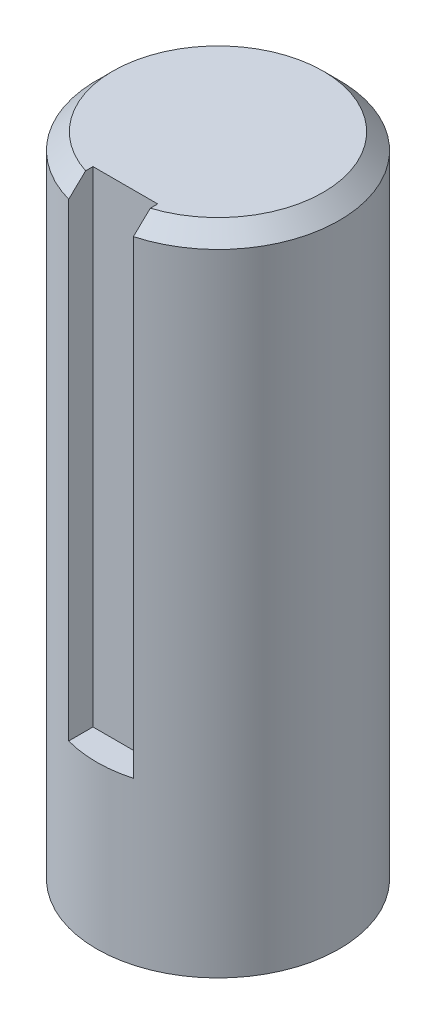
ISO-10303-21;
HEADER;
FILE_DESCRIPTION(('STEP AP214'),'2;1');
FILE_NAME('part.step','',(''),(''),'','','');
FILE_SCHEMA(('AUTOMOTIVE_DESIGN { 1 0 10303 214 1 1 1 1 }'));
ENDSEC;
DATA;
#1=APPLICATION_CONTEXT('core data for automotive mechanical design processes');
#2=APPLICATION_PROTOCOL_DEFINITION('international standard','automotive_design',2000,#1);
#3=PRODUCT_CONTEXT('',#1,'mechanical');
#4=PRODUCT('Part','Part','',(#3));
#5=PRODUCT_RELATED_PRODUCT_CATEGORY('part','',(#4));
#6=PRODUCT_DEFINITION_FORMATION('','',#4);
#7=PRODUCT_DEFINITION_CONTEXT('part definition',#1,'design');
#8=PRODUCT_DEFINITION('design','',#6,#7);
#9=PRODUCT_DEFINITION_SHAPE('','',#8);
#10=(LENGTH_UNIT() NAMED_UNIT(*) SI_UNIT(.MILLI.,.METRE.));
#11=(NAMED_UNIT(*) PLANE_ANGLE_UNIT() SI_UNIT($,.RADIAN.));
#12=(NAMED_UNIT(*) SI_UNIT($,.STERADIAN.) SOLID_ANGLE_UNIT());
#13=UNCERTAINTY_MEASURE_WITH_UNIT(LENGTH_MEASURE(1.E-05),#10,'distance_accuracy_value','');
#14=(GEOMETRIC_REPRESENTATION_CONTEXT(3) GLOBAL_UNCERTAINTY_ASSIGNED_CONTEXT((#13)) GLOBAL_UNIT_ASSIGNED_CONTEXT((#10,
#11,#12)) REPRESENTATION_CONTEXT('',''));
#15=CARTESIAN_POINT('',(0.,0.,0.));
#16=DIRECTION('',(0.,0.,1.));
#17=DIRECTION('',(1.,0.,0.));
#18=AXIS2_PLACEMENT_3D('',#15,#16,#17);
#19=CARTESIAN_POINT('',(0.,80.,0.));
#20=DIRECTION('',(0.,-1.,0.));
#21=DIRECTION('',(0.,0.,-1.));
#22=AXIS2_PLACEMENT_3D('',#19,#20,#21);
#23=CYLINDRICAL_SURFACE('',#22,15.);
#24=CARTESIAN_POINT('',(0.,20.,0.));
#25=DIRECTION('',(0.,1.,0.));
#26=DIRECTION('',(0.,0.,1.));
#27=AXIS2_PLACEMENT_3D('',#24,#25,#26);
#28=CIRCLE('',#27,15.);
#29=CARTESIAN_POINT('',(-4.,20.,14.456832294801));
#30=VERTEX_POINT('',#29);
#31=CARTESIAN_POINT('',(4.,20.,14.456832294801));
#32=VERTEX_POINT('',#31);
#33=EDGE_CURVE('E106',#30,#32,#28,.T.);
#34=ORIENTED_EDGE('',*,*,#33,.F.);
#35=DIRECTION('',(0.,1.,0.));
#36=VECTOR('',#35,1.);
#37=CARTESIAN_POINT('',(-4.,20.,14.456832294801));
#38=LINE('',#37,#36);
#39=CARTESIAN_POINT('',(-4.,78.,14.456832294801));
#40=VERTEX_POINT('',#39);
#41=EDGE_CURVE('E91',#30,#40,#38,.T.);
#42=ORIENTED_EDGE('',*,*,#41,.T.);
#43=CARTESIAN_POINT('',(0.,78.,0.));
#44=DIRECTION('',(0.,1.,0.));
#45=DIRECTION('',(0.,0.,1.));
#46=AXIS2_PLACEMENT_3D('',#43,#44,#45);
#47=CIRCLE('',#46,15.);
#48=CARTESIAN_POINT('',(4.,78.,14.456832294801));
#49=VERTEX_POINT('',#48);
#50=EDGE_CURVE('E134',#40,#49,#47,.F.);
#51=ORIENTED_EDGE('',*,*,#50,.T.);
#52=DIRECTION('',(0.,1.,0.));
#53=VECTOR('',#52,1.);
#54=CARTESIAN_POINT('',(4.,20.,14.456832294801));
#55=LINE('',#54,#53);
#56=EDGE_CURVE('E63',#32,#49,#55,.T.);
#57=ORIENTED_EDGE('',*,*,#56,.F.);
#58=EDGE_LOOP('',(#34,#42,#51,#57));
#59=FACE_BOUND('',#58,.T.);
#60=CARTESIAN_POINT('',(0.,0.,0.));
#61=DIRECTION('',(0.,1.,0.));
#62=DIRECTION('',(0.,0.,1.));
#63=AXIS2_PLACEMENT_3D('',#60,#61,#62);
#64=CIRCLE('',#63,15.);
#65=CARTESIAN_POINT('',(0.,0.,15.));
#66=VERTEX_POINT('',#65);
#67=EDGE_CURVE('E124',#66,#66,#64,.T.);
#68=ORIENTED_EDGE('',*,*,#67,.T.);
#69=EDGE_LOOP('',(#68));
#70=FACE_BOUND('',#69,.T.);
#71=ADVANCED_FACE('F41',(#59,#70),#23,.T.);
#72=CARTESIAN_POINT('',(0.,80.,0.));
#73=DIRECTION('',(0.,1.,0.));
#74=DIRECTION('',(0.,0.,1.));
#75=AXIS2_PLACEMENT_3D('',#72,#73,#74);
#76=PLANE('',#75);
#77=DIRECTION('',(0.,0.,1.));
#78=VECTOR('',#77,1.);
#79=CARTESIAN_POINT('',(-4.,80.,14.456832294801));
#80=LINE('',#79,#78);
#81=CARTESIAN_POINT('',(-4.,80.,11.456832294801));
#82=VERTEX_POINT('',#81);
#83=CARTESIAN_POINT('',(-4.,80.,12.3693168768529));
#84=VERTEX_POINT('',#83);
#85=EDGE_CURVE('E116',#82,#84,#80,.T.);
#86=ORIENTED_EDGE('',*,*,#85,.F.);
#87=DIRECTION('',(-1.,0.,0.));
#88=VECTOR('',#87,1.);
#89=CARTESIAN_POINT('',(4.,80.,11.456832294801));
#90=LINE('',#89,#88);
#91=CARTESIAN_POINT('',(4.,80.,11.456832294801));
#92=VERTEX_POINT('',#91);
#93=EDGE_CURVE('E108',#92,#82,#90,.T.);
#94=ORIENTED_EDGE('',*,*,#93,.F.);
#95=DIRECTION('',(0.,0.,-1.));
#96=VECTOR('',#95,1.);
#97=CARTESIAN_POINT('',(4.,80.,14.456832294801));
#98=LINE('',#97,#96);
#99=CARTESIAN_POINT('',(4.,80.,12.3693168768529));
#100=VERTEX_POINT('',#99);
#101=EDGE_CURVE('E118',#100,#92,#98,.T.);
#102=ORIENTED_EDGE('',*,*,#101,.F.);
#103=CARTESIAN_POINT('',(0.,80.,0.));
#104=DIRECTION('',(0.,1.,0.));
#105=DIRECTION('',(0.,0.,1.));
#106=AXIS2_PLACEMENT_3D('',#103,#104,#105);
#107=CIRCLE('',#106,13.);
#108=EDGE_CURVE('E131',#100,#84,#107,.T.);
#109=ORIENTED_EDGE('',*,*,#108,.T.);
#110=EDGE_LOOP('',(#86,#94,#102,#109));
#111=FACE_BOUND('',#110,.T.);
#112=ADVANCED_FACE('F149',(#111),#76,.T.);
#113=CARTESIAN_POINT('',(0.,0.,0.));
#114=DIRECTION('',(0.,1.,0.));
#115=DIRECTION('',(0.,0.,1.));
#116=AXIS2_PLACEMENT_3D('',#113,#114,#115);
#117=PLANE('',#116);
#118=ORIENTED_EDGE('',*,*,#67,.F.);
#119=EDGE_LOOP('',(#118));
#120=FACE_BOUND('',#119,.T.);
#121=ADVANCED_FACE('F152',(#120),#117,.F.);
#122=CARTESIAN_POINT('',(0.,80.,0.));
#123=DIRECTION('',(0.,-1.,0.));
#124=DIRECTION('',(0.,0.,-1.));
#125=AXIS2_PLACEMENT_3D('',#122,#123,#124);
#126=CONICAL_SURFACE('',#125,13.,0.785398163397449);
#127=CARTESIAN_POINT('',(-4.,83.6057512754639,8.50011229916679));
#128=CARTESIAN_POINT('',(-4.,83.4518412492222,8.67020473871914));
#129=CARTESIAN_POINT('',(-4.,83.2974792863819,8.83988694869966));
#130=CARTESIAN_POINT('',(-4.,82.9879712756458,9.17853305812137));
#131=CARTESIAN_POINT('',(-4.,82.8328252324362,9.34749696184454));
#132=CARTESIAN_POINT('',(-4.,82.3663952504219,9.85345949572392));
#133=CARTESIAN_POINT('',(-4.,82.0541121686576,10.1895369835245));
#134=CARTESIAN_POINT('',(-4.,81.4275669431542,10.8598044699871));
#135=CARTESIAN_POINT('',(-4.,81.1133049094371,11.1939945716546));
#136=CARTESIAN_POINT('',(-4.,80.4832337069049,11.86091656471));
#137=CARTESIAN_POINT('',(-4.,80.1674245274185,12.1936484460099));
#138=CARTESIAN_POINT('',(-4.,79.2182481145543,13.1900652140549));
#139=CARTESIAN_POINT('',(-4.,78.5830763563553,13.8520304992261));
#140=CARTESIAN_POINT('',(-4.,77.3096120960346,15.1729623288266));
#141=CARTESIAN_POINT('',(-4.,76.6713195559216,15.8319288365604));
#142=CARTESIAN_POINT('',(-4.,75.7769086995619,16.7522731100043));
#143=CARTESIAN_POINT('',(-4.,75.5217006461428,17.0145361760872));
#144=CARTESIAN_POINT('',(-4.,75.0109765950076,17.5387702317973));
#145=CARTESIAN_POINT('',(-4.,74.7554605925808,17.8007412168356));
#146=CARTESIAN_POINT('',(-4.,74.4998128324926,18.062583570265));
#147=B_SPLINE_CURVE_WITH_KNOTS('',3,(#127,#128,#129,#130,#131,#132,#133,#134,#135,#136,#137,
#138,#139,#140,#141,#142,#143,#144,#145,#146),.UNSPECIFIED.,.F.,.F.,(4,2,2,2,2,2,2,2,2,4),(0.,
0.688167484228455,1.37633086037428,2.7526250650912,4.12884341723394,5.5050712750682,
8.2572830843817,11.0095284818867,12.1073523284534,13.205193186608),.UNSPECIFIED.);
#148=EDGE_CURVE('E11',#84,#40,#147,.T.);
#149=ORIENTED_EDGE('',*,*,#148,.F.);
#150=ORIENTED_EDGE('',*,*,#108,.F.);
#151=CARTESIAN_POINT('',(4.,74.4998128324926,18.062583570265));
#152=CARTESIAN_POINT('',(4.,74.8841828699195,17.668886768575));
#153=CARTESIAN_POINT('',(4.,75.268266391296,17.2749096158912));
#154=CARTESIAN_POINT('',(4.,76.0356952868894,16.4862378057951));
#155=CARTESIAN_POINT('',(4.,76.4190406617419,16.0915431490011));
#156=CARTESIAN_POINT('',(4.,77.1848019881165,15.3013065314426));
#157=CARTESIAN_POINT('',(4.,77.5672180028687,14.9057646319736));
#158=CARTESIAN_POINT('',(4.,78.3309119640226,14.1135837323542));
#159=CARTESIAN_POINT('',(4.,78.7121899112966,13.716944733045));
#160=CARTESIAN_POINT('',(4.,79.4733136977631,12.9222408679139));
#161=CARTESIAN_POINT('',(4.,79.8531594342154,12.5241759036489));
#162=CARTESIAN_POINT('',(4.,80.6109373999806,11.7262333815328));
#163=CARTESIAN_POINT('',(4.,80.9888696471683,11.3263558406803));
#164=CARTESIAN_POINT('',(4.,81.553842420265,10.7247025757392));
#165=CARTESIAN_POINT('',(4.,81.7418528834683,10.5238376276457));
#166=CARTESIAN_POINT('',(4.,82.1171081191753,10.1213944582997));
#167=CARTESIAN_POINT('',(4.,82.3043528936591,9.91981623889418));
#168=CARTESIAN_POINT('',(4.,82.6779442347269,9.51581686325583));
#169=CARTESIAN_POINT('',(4.,82.8642907732216,9.31339568102641));
#170=CARTESIAN_POINT('',(4.,83.2358898508857,8.90754861922155));
#171=CARTESIAN_POINT('',(4.,83.4211423802863,8.70412273070443));
#172=CARTESIAN_POINT('',(4.,83.605751275464,8.50011229916677));
#173=B_SPLINE_CURVE_WITH_KNOTS('',3,(#151,#152,#153,#154,#155,#156,#157,#158,#159,#160,#161,
#162,#163,#164,#165,#166,#167,#168,#169,#170,#171,#172),.UNSPECIFIED.,.F.,.F.,(4,2,2,2,2,2,2,2,
2,2,4),(0.,1.65064811682265,3.3012948117183,4.95182586945858,6.60235566192854,8.25300168521996,
9.90363226055622,10.729010549842,11.5543867034229,12.379788502584,13.2051976609357),.UNSPECIFIED.);
#174=EDGE_CURVE('E56',#49,#100,#173,.T.);
#175=ORIENTED_EDGE('',*,*,#174,.F.);
#176=ORIENTED_EDGE('',*,*,#50,.F.);
#177=EDGE_LOOP('',(#149,#150,#175,#176));
#178=FACE_BOUND('',#177,.T.);
#179=ADVANCED_FACE('F44',(#178),#126,.T.);
#180=CARTESIAN_POINT('',(-4.,20.,14.456832294801));
#181=DIRECTION('',(-1.,0.,0.));
#182=DIRECTION('',(0.,0.,1.));
#183=AXIS2_PLACEMENT_3D('',#180,#181,#182);
#184=PLANE('',#183);
#185=ORIENTED_EDGE('',*,*,#148,.T.);
#186=ORIENTED_EDGE('',*,*,#41,.F.);
#187=DIRECTION('',(0.,0.,1.));
#188=VECTOR('',#187,1.);
#189=CARTESIAN_POINT('',(-4.,20.,14.456832294801));
#190=LINE('',#189,#188);
#191=CARTESIAN_POINT('',(-4.,20.,11.456832294801));
#192=VERTEX_POINT('',#191);
#193=EDGE_CURVE('E94',#192,#30,#190,.T.);
#194=ORIENTED_EDGE('',*,*,#193,.F.);
#195=DIRECTION('',(0.,1.,0.));
#196=VECTOR('',#195,1.);
#197=CARTESIAN_POINT('',(-4.,20.,11.456832294801));
#198=LINE('',#197,#196);
#199=EDGE_CURVE('E122',#192,#82,#198,.T.);
#200=ORIENTED_EDGE('',*,*,#199,.T.);
#201=ORIENTED_EDGE('',*,*,#85,.T.);
#202=EDGE_LOOP('',(#185,#186,#194,#200,#201));
#203=FACE_BOUND('',#202,.T.);
#204=ADVANCED_FACE('F93',(#203),#184,.F.);
#205=CARTESIAN_POINT('',(4.,20.,11.456832294801));
#206=DIRECTION('',(0.,0.,-1.));
#207=DIRECTION('',(-1.,0.,0.));
#208=AXIS2_PLACEMENT_3D('',#205,#206,#207);
#209=PLANE('',#208);
#210=ORIENTED_EDGE('',*,*,#93,.T.);
#211=ORIENTED_EDGE('',*,*,#199,.F.);
#212=DIRECTION('',(-1.,0.,0.));
#213=VECTOR('',#212,1.);
#214=CARTESIAN_POINT('',(4.,20.,11.456832294801));
#215=LINE('',#214,#213);
#216=CARTESIAN_POINT('',(4.,20.,11.456832294801));
#217=VERTEX_POINT('',#216);
#218=EDGE_CURVE('E100',#217,#192,#215,.T.);
#219=ORIENTED_EDGE('',*,*,#218,.F.);
#220=DIRECTION('',(0.,1.,0.));
#221=VECTOR('',#220,1.);
#222=CARTESIAN_POINT('',(4.,20.,11.456832294801));
#223=LINE('',#222,#221);
#224=EDGE_CURVE('E125',#217,#92,#223,.T.);
#225=ORIENTED_EDGE('',*,*,#224,.T.);
#226=EDGE_LOOP('',(#210,#211,#219,#225));
#227=FACE_BOUND('',#226,.T.);
#228=ADVANCED_FACE('F144',(#227),#209,.F.);
#229=CARTESIAN_POINT('',(4.,20.,14.456832294801));
#230=DIRECTION('',(1.,0.,0.));
#231=DIRECTION('',(0.,0.,-1.));
#232=AXIS2_PLACEMENT_3D('',#229,#230,#231);
#233=PLANE('',#232);
#234=ORIENTED_EDGE('',*,*,#174,.T.);
#235=ORIENTED_EDGE('',*,*,#101,.T.);
#236=ORIENTED_EDGE('',*,*,#224,.F.);
#237=DIRECTION('',(0.,0.,-1.));
#238=VECTOR('',#237,1.);
#239=CARTESIAN_POINT('',(4.,20.,14.456832294801));
#240=LINE('',#239,#238);
#241=EDGE_CURVE('E111',#32,#217,#240,.T.);
#242=ORIENTED_EDGE('',*,*,#241,.F.);
#243=ORIENTED_EDGE('',*,*,#56,.T.);
#244=EDGE_LOOP('',(#234,#235,#236,#242,#243));
#245=FACE_BOUND('',#244,.T.);
#246=ADVANCED_FACE('F140',(#245),#233,.F.);
#247=CARTESIAN_POINT('',(0.,20.,0.));
#248=DIRECTION('',(0.,1.,0.));
#249=DIRECTION('',(0.,0.,1.));
#250=AXIS2_PLACEMENT_3D('',#247,#248,#249);
#251=PLANE('',#250);
#252=ORIENTED_EDGE('',*,*,#193,.T.);
#253=ORIENTED_EDGE('',*,*,#33,.T.);
#254=ORIENTED_EDGE('',*,*,#241,.T.);
#255=ORIENTED_EDGE('',*,*,#218,.T.);
#256=EDGE_LOOP('',(#252,#253,#254,#255));
#257=FACE_BOUND('',#256,.T.);
#258=ADVANCED_FACE('F104',(#257),#251,.T.);
#259=CLOSED_SHELL('',(#71,#112,#121,#179,#204,#228,#246,#258));
#260=MANIFOLD_SOLID_BREP('B2',#259);
#261=ADVANCED_BREP_SHAPE_REPRESENTATION('',(#18,#260),#14);
#262=SHAPE_DEFINITION_REPRESENTATION(#9,#261);
ENDSEC;
END-ISO-10303-21;
